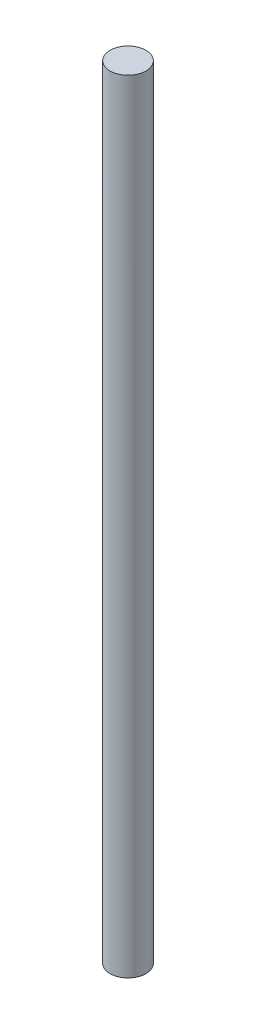
ISO-10303-21;
HEADER;
FILE_DESCRIPTION(('STEP AP214'),'2;1');
FILE_NAME('part.step','',(''),(''),'','','');
FILE_SCHEMA(('AUTOMOTIVE_DESIGN { 1 0 10303 214 1 1 1 1 }'));
ENDSEC;
DATA;
#1=APPLICATION_CONTEXT('core data for automotive mechanical design processes');
#2=APPLICATION_PROTOCOL_DEFINITION('international standard','automotive_design',2000,#1);
#3=PRODUCT_CONTEXT('',#1,'mechanical');
#4=PRODUCT('Part','Part','',(#3));
#5=PRODUCT_RELATED_PRODUCT_CATEGORY('part','',(#4));
#6=PRODUCT_DEFINITION_FORMATION('','',#4);
#7=PRODUCT_DEFINITION_CONTEXT('part definition',#1,'design');
#8=PRODUCT_DEFINITION('design','',#6,#7);
#9=PRODUCT_DEFINITION_SHAPE('','',#8);
#10=(LENGTH_UNIT() NAMED_UNIT(*) SI_UNIT(.MILLI.,.METRE.));
#11=(NAMED_UNIT(*) PLANE_ANGLE_UNIT() SI_UNIT($,.RADIAN.));
#12=(NAMED_UNIT(*) SI_UNIT($,.STERADIAN.) SOLID_ANGLE_UNIT());
#13=UNCERTAINTY_MEASURE_WITH_UNIT(LENGTH_MEASURE(1.E-05),#10,'distance_accuracy_value','');
#14=(GEOMETRIC_REPRESENTATION_CONTEXT(3) GLOBAL_UNCERTAINTY_ASSIGNED_CONTEXT((#13)) GLOBAL_UNIT_ASSIGNED_CONTEXT((#10,
#11,#12)) REPRESENTATION_CONTEXT('',''));
#15=CARTESIAN_POINT('',(0.,0.,0.));
#16=DIRECTION('',(0.,0.,1.));
#17=DIRECTION('',(1.,0.,0.));
#18=AXIS2_PLACEMENT_3D('',#15,#16,#17);
#19=CARTESIAN_POINT('',(0.,190.,0.));
#20=DIRECTION('',(0.,-1.,0.));
#21=DIRECTION('',(0.,0.,-1.));
#22=AXIS2_PLACEMENT_3D('',#19,#20,#21);
#23=CYLINDRICAL_SURFACE('',#22,4.);
#24=CARTESIAN_POINT('',(0.,190.,0.));
#25=DIRECTION('',(0.,1.,0.));
#26=DIRECTION('',(0.,0.,1.));
#27=AXIS2_PLACEMENT_3D('',#24,#25,#26);
#28=CIRCLE('',#27,4.);
#29=CARTESIAN_POINT('',(0.,190.,4.));
#30=VERTEX_POINT('',#29);
#31=EDGE_CURVE('E10',#30,#30,#28,.T.);
#32=ORIENTED_EDGE('',*,*,#31,.F.);
#33=EDGE_LOOP('',(#32));
#34=FACE_BOUND('',#33,.T.);
#35=CARTESIAN_POINT('',(0.,15.61,0.));
#36=DIRECTION('',(0.,-1.,0.));
#37=DIRECTION('',(0.,0.,-1.));
#38=AXIS2_PLACEMENT_3D('',#35,#36,#37);
#39=CIRCLE('',#38,4.);
#40=CARTESIAN_POINT('',(0.,15.61,-4.));
#41=VERTEX_POINT('',#40);
#42=EDGE_CURVE('E46',#41,#41,#39,.F.);
#43=ORIENTED_EDGE('',*,*,#42,.T.);
#44=EDGE_LOOP('',(#43));
#45=FACE_BOUND('',#44,.T.);
#46=ADVANCED_FACE('F40',(#34,#45),#23,.T.);
#47=CARTESIAN_POINT('',(0.,190.,0.));
#48=DIRECTION('',(0.,1.,0.));
#49=DIRECTION('',(0.,0.,1.));
#50=AXIS2_PLACEMENT_3D('',#47,#48,#49);
#51=PLANE('',#50);
#52=ORIENTED_EDGE('',*,*,#31,.T.);
#53=EDGE_LOOP('',(#52));
#54=FACE_BOUND('',#53,.T.);
#55=ADVANCED_FACE('F55',(#54),#51,.T.);
#56=CARTESIAN_POINT('',(14.5780275587012,15.61,-16.4539087300784));
#57=DIRECTION('',(0.,-1.,0.));
#58=DIRECTION('',(0.854814248273636,0.,-0.518934100776177));
#59=AXIS2_PLACEMENT_3D('',#56,#57,#58);
#60=PLANE('',#59);
#61=ORIENTED_EDGE('',*,*,#42,.F.);
#62=EDGE_LOOP('',(#61));
#63=FACE_BOUND('',#62,.T.);
#64=ADVANCED_FACE('F53',(#63),#60,.T.);
#65=CLOSED_SHELL('',(#46,#55,#64));
#66=MANIFOLD_SOLID_BREP('B2',#65);
#67=ADVANCED_BREP_SHAPE_REPRESENTATION('',(#18,#66),#14);
#68=SHAPE_DEFINITION_REPRESENTATION(#9,#67);
ENDSEC;
END-ISO-10303-21;
